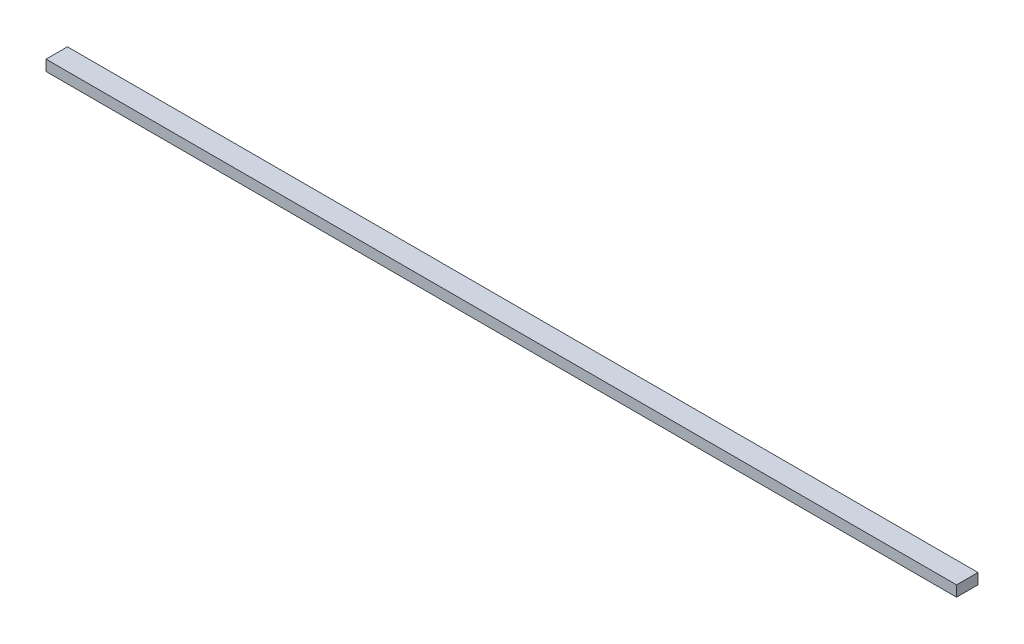
ISO-10303-21;
HEADER;
FILE_DESCRIPTION(('STEP AP214'),'2;1');
FILE_NAME('part.step','',(''),(''),'','','');
FILE_SCHEMA(('AUTOMOTIVE_DESIGN { 1 0 10303 214 1 1 1 1 }'));
ENDSEC;
DATA;
#1=APPLICATION_CONTEXT('core data for automotive mechanical design processes');
#2=APPLICATION_PROTOCOL_DEFINITION('international standard','automotive_design',2000,#1);
#3=PRODUCT_CONTEXT('',#1,'mechanical');
#4=PRODUCT('Part','Part','',(#3));
#5=PRODUCT_RELATED_PRODUCT_CATEGORY('part','',(#4));
#6=PRODUCT_DEFINITION_FORMATION('','',#4);
#7=PRODUCT_DEFINITION_CONTEXT('part definition',#1,'design');
#8=PRODUCT_DEFINITION('design','',#6,#7);
#9=PRODUCT_DEFINITION_SHAPE('','',#8);
#10=(LENGTH_UNIT() NAMED_UNIT(*) SI_UNIT(.MILLI.,.METRE.));
#11=(NAMED_UNIT(*) PLANE_ANGLE_UNIT() SI_UNIT($,.RADIAN.));
#12=(NAMED_UNIT(*) SI_UNIT($,.STERADIAN.) SOLID_ANGLE_UNIT());
#13=UNCERTAINTY_MEASURE_WITH_UNIT(LENGTH_MEASURE(1.E-05),#10,'distance_accuracy_value','');
#14=(GEOMETRIC_REPRESENTATION_CONTEXT(3) GLOBAL_UNCERTAINTY_ASSIGNED_CONTEXT((#13)) GLOBAL_UNIT_ASSIGNED_CONTEXT((#10,
#11,#12)) REPRESENTATION_CONTEXT('',''));
#15=CARTESIAN_POINT('',(0.,0.,0.));
#16=DIRECTION('',(0.,0.,1.));
#17=DIRECTION('',(1.,0.,0.));
#18=AXIS2_PLACEMENT_3D('',#15,#16,#17);
#19=CARTESIAN_POINT('',(-158.25302911181,28.0584870205207,80.));
#20=DIRECTION('',(1.,0.,0.));
#21=DIRECTION('',(0.,0.,-1.));
#22=AXIS2_PLACEMENT_3D('',#19,#20,#21);
#23=PLANE('',#22);
#24=DIRECTION('',(0.,-1.,0.));
#25=VECTOR('',#24,1.);
#26=CARTESIAN_POINT('',(-158.25302911181,28.0584870205207,0.));
#27=LINE('',#26,#25);
#28=CARTESIAN_POINT('',(-158.25302911181,28.0584870205207,0.));
#29=VERTEX_POINT('',#28);
#30=CARTESIAN_POINT('',(-158.25302911181,-11.9415129794793,0.));
#31=VERTEX_POINT('',#30);
#32=EDGE_CURVE('E96',#29,#31,#27,.T.);
#33=ORIENTED_EDGE('',*,*,#32,.T.);
#34=DIRECTION('',(0.,0.,-1.));
#35=VECTOR('',#34,1.);
#36=CARTESIAN_POINT('',(-158.25302911181,-11.9415129794793,80.));
#37=LINE('',#36,#35);
#38=CARTESIAN_POINT('',(-158.25302911181,-11.9415129794793,80.));
#39=VERTEX_POINT('',#38);
#40=EDGE_CURVE('E11',#39,#31,#37,.T.);
#41=ORIENTED_EDGE('',*,*,#40,.F.);
#42=DIRECTION('',(0.,-1.,0.));
#43=VECTOR('',#42,1.);
#44=CARTESIAN_POINT('',(-158.25302911181,28.0584870205207,80.));
#45=LINE('',#44,#43);
#46=CARTESIAN_POINT('',(-158.25302911181,28.0584870205207,80.));
#47=VERTEX_POINT('',#46);
#48=EDGE_CURVE('E84',#47,#39,#45,.T.);
#49=ORIENTED_EDGE('',*,*,#48,.F.);
#50=DIRECTION('',(0.,0.,-1.));
#51=VECTOR('',#50,1.);
#52=CARTESIAN_POINT('',(-158.25302911181,28.0584870205207,80.));
#53=LINE('',#52,#51);
#54=EDGE_CURVE('E92',#47,#29,#53,.T.);
#55=ORIENTED_EDGE('',*,*,#54,.T.);
#56=EDGE_LOOP('',(#33,#41,#49,#55));
#57=FACE_BOUND('',#56,.T.);
#58=ADVANCED_FACE('F33',(#57),#23,.F.);
#59=CARTESIAN_POINT('',(-158.25302911181,-11.9415129794793,80.));
#60=DIRECTION('',(0.,1.,0.));
#61=DIRECTION('',(0.,0.,1.));
#62=AXIS2_PLACEMENT_3D('',#59,#60,#61);
#63=PLANE('',#62);
#64=DIRECTION('',(1.,0.,0.));
#65=VECTOR('',#64,1.);
#66=CARTESIAN_POINT('',(-158.25302911181,-11.9415129794793,0.));
#67=LINE('',#66,#65);
#68=CARTESIAN_POINT('',(3241.74697088819,-11.9415129794793,0.));
#69=VERTEX_POINT('',#68);
#70=EDGE_CURVE('E88',#31,#69,#67,.T.);
#71=ORIENTED_EDGE('',*,*,#70,.T.);
#72=DIRECTION('',(0.,0.,-1.));
#73=VECTOR('',#72,1.);
#74=CARTESIAN_POINT('',(3241.74697088819,-11.9415129794793,80.));
#75=LINE('',#74,#73);
#76=CARTESIAN_POINT('',(3241.74697088819,-11.9415129794793,80.));
#77=VERTEX_POINT('',#76);
#78=EDGE_CURVE('E41',#77,#69,#75,.T.);
#79=ORIENTED_EDGE('',*,*,#78,.F.);
#80=DIRECTION('',(1.,0.,0.));
#81=VECTOR('',#80,1.);
#82=CARTESIAN_POINT('',(-158.25302911181,-11.9415129794793,80.));
#83=LINE('',#82,#81);
#84=EDGE_CURVE('E79',#39,#77,#83,.T.);
#85=ORIENTED_EDGE('',*,*,#84,.F.);
#86=ORIENTED_EDGE('',*,*,#40,.T.);
#87=EDGE_LOOP('',(#71,#79,#85,#86));
#88=FACE_BOUND('',#87,.T.);
#89=ADVANCED_FACE('F87',(#88),#63,.F.);
#90=CARTESIAN_POINT('',(3241.74697088819,28.0584870205207,80.));
#91=DIRECTION('',(-1.,0.,0.));
#92=DIRECTION('',(0.,0.,1.));
#93=AXIS2_PLACEMENT_3D('',#90,#91,#92);
#94=PLANE('',#93);
#95=DIRECTION('',(0.,1.,0.));
#96=VECTOR('',#95,1.);
#97=CARTESIAN_POINT('',(3241.74697088819,28.0584870205207,0.));
#98=LINE('',#97,#96);
#99=CARTESIAN_POINT('',(3241.74697088819,28.0584870205207,0.));
#100=VERTEX_POINT('',#99);
#101=EDGE_CURVE('E66',#69,#100,#98,.T.);
#102=ORIENTED_EDGE('',*,*,#101,.T.);
#103=DIRECTION('',(0.,0.,-1.));
#104=VECTOR('',#103,1.);
#105=CARTESIAN_POINT('',(3241.74697088819,28.0584870205207,80.));
#106=LINE('',#105,#104);
#107=CARTESIAN_POINT('',(3241.74697088819,28.0584870205207,80.));
#108=VERTEX_POINT('',#107);
#109=EDGE_CURVE('E89',#108,#100,#106,.T.);
#110=ORIENTED_EDGE('',*,*,#109,.F.);
#111=DIRECTION('',(0.,1.,0.));
#112=VECTOR('',#111,1.);
#113=CARTESIAN_POINT('',(3241.74697088819,28.0584870205207,80.));
#114=LINE('',#113,#112);
#115=EDGE_CURVE('E82',#77,#108,#114,.T.);
#116=ORIENTED_EDGE('',*,*,#115,.F.);
#117=ORIENTED_EDGE('',*,*,#78,.T.);
#118=EDGE_LOOP('',(#102,#110,#116,#117));
#119=FACE_BOUND('',#118,.T.);
#120=ADVANCED_FACE('F90',(#119),#94,.F.);
#121=CARTESIAN_POINT('',(-158.25302911181,28.0584870205207,80.));
#122=DIRECTION('',(0.,-1.,0.));
#123=DIRECTION('',(0.,0.,-1.));
#124=AXIS2_PLACEMENT_3D('',#121,#122,#123);
#125=PLANE('',#124);
#126=DIRECTION('',(-1.,0.,0.));
#127=VECTOR('',#126,1.);
#128=CARTESIAN_POINT('',(-158.25302911181,28.0584870205207,0.));
#129=LINE('',#128,#127);
#130=EDGE_CURVE('E72',#100,#29,#129,.T.);
#131=ORIENTED_EDGE('',*,*,#130,.T.);
#132=ORIENTED_EDGE('',*,*,#54,.F.);
#133=DIRECTION('',(-1.,0.,0.));
#134=VECTOR('',#133,1.);
#135=CARTESIAN_POINT('',(-158.25302911181,28.0584870205207,80.));
#136=LINE('',#135,#134);
#137=EDGE_CURVE('E49',#108,#47,#136,.T.);
#138=ORIENTED_EDGE('',*,*,#137,.F.);
#139=ORIENTED_EDGE('',*,*,#109,.T.);
#140=EDGE_LOOP('',(#131,#132,#138,#139));
#141=FACE_BOUND('',#140,.T.);
#142=ADVANCED_FACE('F103',(#141),#125,.F.);
#143=CARTESIAN_POINT('',(0.,0.,80.));
#144=DIRECTION('',(0.,0.,1.));
#145=DIRECTION('',(1.,0.,0.));
#146=AXIS2_PLACEMENT_3D('',#143,#144,#145);
#147=PLANE('',#146);
#148=ORIENTED_EDGE('',*,*,#48,.T.);
#149=ORIENTED_EDGE('',*,*,#84,.T.);
#150=ORIENTED_EDGE('',*,*,#115,.T.);
#151=ORIENTED_EDGE('',*,*,#137,.T.);
#152=EDGE_LOOP('',(#148,#149,#150,#151));
#153=FACE_BOUND('',#152,.T.);
#154=ADVANCED_FACE('F80',(#153),#147,.T.);
#155=CARTESIAN_POINT('',(0.,0.,0.));
#156=DIRECTION('',(0.,0.,1.));
#157=DIRECTION('',(1.,0.,0.));
#158=AXIS2_PLACEMENT_3D('',#155,#156,#157);
#159=PLANE('',#158);
#160=ORIENTED_EDGE('',*,*,#32,.F.);
#161=ORIENTED_EDGE('',*,*,#130,.F.);
#162=ORIENTED_EDGE('',*,*,#101,.F.);
#163=ORIENTED_EDGE('',*,*,#70,.F.);
#164=EDGE_LOOP('',(#160,#161,#162,#163));
#165=FACE_BOUND('',#164,.T.);
#166=ADVANCED_FACE('F106',(#165),#159,.F.);
#167=CLOSED_SHELL('',(#58,#89,#120,#142,#154,#166));
#168=MANIFOLD_SOLID_BREP('B2',#167);
#169=ADVANCED_BREP_SHAPE_REPRESENTATION('',(#18,#168),#14);
#170=SHAPE_DEFINITION_REPRESENTATION(#9,#169);
ENDSEC;
END-ISO-10303-21;
